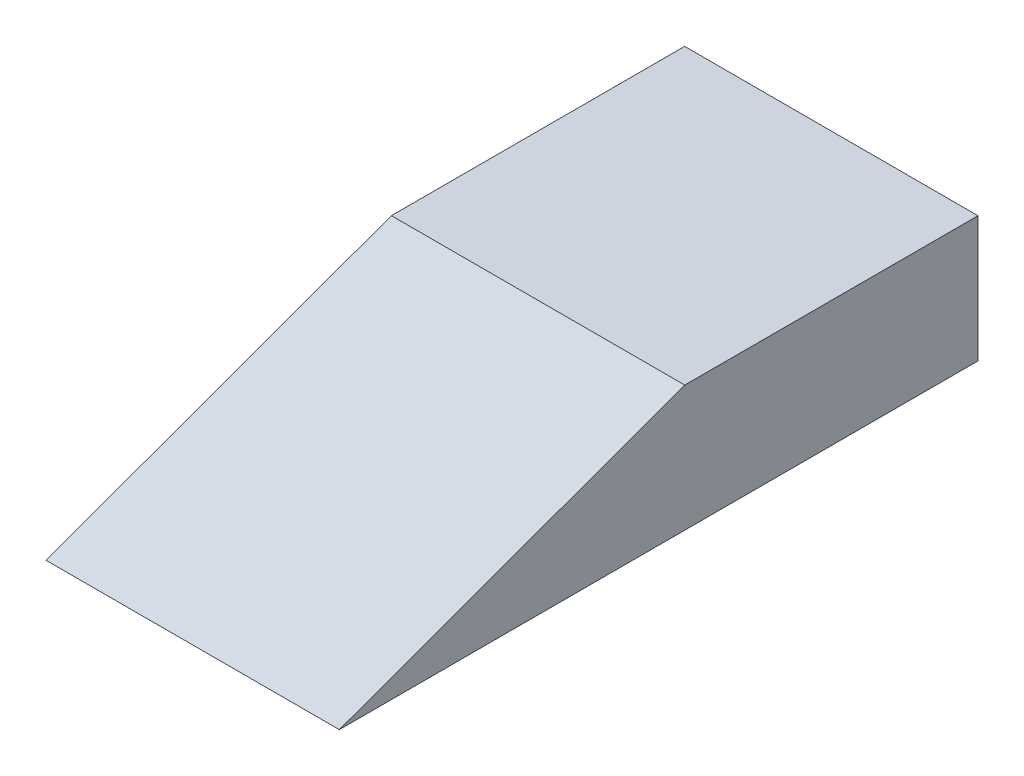
ISO-10303-21;
HEADER;
FILE_DESCRIPTION(('STEP AP214'),'2;1');
FILE_NAME('part.step','',(''),(''),'','','');
FILE_SCHEMA(('AUTOMOTIVE_DESIGN { 1 0 10303 214 1 1 1 1 }'));
ENDSEC;
DATA;
#1=APPLICATION_CONTEXT('core data for automotive mechanical design processes');
#2=APPLICATION_PROTOCOL_DEFINITION('international standard','automotive_design',2000,#1);
#3=PRODUCT_CONTEXT('',#1,'mechanical');
#4=PRODUCT('Part','Part','',(#3));
#5=PRODUCT_RELATED_PRODUCT_CATEGORY('part','',(#4));
#6=PRODUCT_DEFINITION_FORMATION('','',#4);
#7=PRODUCT_DEFINITION_CONTEXT('part definition',#1,'design');
#8=PRODUCT_DEFINITION('design','',#6,#7);
#9=PRODUCT_DEFINITION_SHAPE('','',#8);
#10=(LENGTH_UNIT() NAMED_UNIT(*) SI_UNIT(.MILLI.,.METRE.));
#11=(NAMED_UNIT(*) PLANE_ANGLE_UNIT() SI_UNIT($,.RADIAN.));
#12=(NAMED_UNIT(*) SI_UNIT($,.STERADIAN.) SOLID_ANGLE_UNIT());
#13=UNCERTAINTY_MEASURE_WITH_UNIT(LENGTH_MEASURE(1.E-05),#10,'distance_accuracy_value','');
#14=(GEOMETRIC_REPRESENTATION_CONTEXT(3) GLOBAL_UNCERTAINTY_ASSIGNED_CONTEXT((#13)) GLOBAL_UNIT_ASSIGNED_CONTEXT((#10,
#11,#12)) REPRESENTATION_CONTEXT('',''));
#15=CARTESIAN_POINT('',(0.,0.,0.));
#16=DIRECTION('',(0.,0.,1.));
#17=DIRECTION('',(1.,0.,0.));
#18=AXIS2_PLACEMENT_3D('',#15,#16,#17);
#19=CARTESIAN_POINT('',(350.,-88.0536277602524,0.));
#20=DIRECTION('',(0.,-1.,0.));
#21=DIRECTION('',(0.,0.,-1.));
#22=AXIS2_PLACEMENT_3D('',#19,#20,#21);
#23=PLANE('',#22);
#24=DIRECTION('',(0.,0.,1.));
#25=VECTOR('',#24,1.);
#26=CARTESIAN_POINT('',(0.,-88.0536277602524,0.));
#27=LINE('',#26,#25);
#28=CARTESIAN_POINT('',(0.,-88.0536277602523,-559.249211356467));
#29=VERTEX_POINT('',#28);
#30=CARTESIAN_POINT('',(0.,-88.0536277602524,202.750788643533));
#31=VERTEX_POINT('',#30);
#32=EDGE_CURVE('E99',#29,#31,#27,.T.);
#33=ORIENTED_EDGE('',*,*,#32,.F.);
#34=DIRECTION('',(-1.,0.,0.));
#35=VECTOR('',#34,1.);
#36=CARTESIAN_POINT('',(350.,-88.0536277602523,-559.249211356467));
#37=LINE('',#36,#35);
#38=CARTESIAN_POINT('',(350.,-88.0536277602523,-559.249211356467));
#39=VERTEX_POINT('',#38);
#40=EDGE_CURVE('E11',#39,#29,#37,.T.);
#41=ORIENTED_EDGE('',*,*,#40,.F.);
#42=DIRECTION('',(0.,0.,1.));
#43=VECTOR('',#42,1.);
#44=CARTESIAN_POINT('',(350.,-88.0536277602524,0.));
#45=LINE('',#44,#43);
#46=CARTESIAN_POINT('',(350.,-88.0536277602524,202.750788643533));
#47=VERTEX_POINT('',#46);
#48=EDGE_CURVE('E92',#39,#47,#45,.T.);
#49=ORIENTED_EDGE('',*,*,#48,.T.);
#50=DIRECTION('',(-1.,0.,0.));
#51=VECTOR('',#50,1.);
#52=CARTESIAN_POINT('',(350.,-88.0536277602524,202.750788643533));
#53=LINE('',#52,#51);
#54=EDGE_CURVE('E74',#47,#31,#53,.T.);
#55=ORIENTED_EDGE('',*,*,#54,.T.);
#56=EDGE_LOOP('',(#33,#41,#49,#55));
#57=FACE_BOUND('',#56,.T.);
#58=ADVANCED_FACE('F36',(#57),#23,.T.);
#59=CARTESIAN_POINT('',(350.,0.,-559.249211356467));
#60=DIRECTION('',(0.,0.,-1.));
#61=DIRECTION('',(-1.,0.,0.));
#62=AXIS2_PLACEMENT_3D('',#59,#60,#61);
#63=PLANE('',#62);
#64=DIRECTION('',(0.,-1.,0.));
#65=VECTOR('',#64,1.);
#66=CARTESIAN_POINT('',(0.,0.,-559.249211356467));
#67=LINE('',#66,#65);
#68=CARTESIAN_POINT('',(0.,61.9463722397476,-559.249211356467));
#69=VERTEX_POINT('',#68);
#70=EDGE_CURVE('E85',#69,#29,#67,.T.);
#71=ORIENTED_EDGE('',*,*,#70,.F.);
#72=DIRECTION('',(-1.,0.,0.));
#73=VECTOR('',#72,1.);
#74=CARTESIAN_POINT('',(350.,61.9463722397476,-559.249211356467));
#75=LINE('',#74,#73);
#76=CARTESIAN_POINT('',(350.,61.9463722397476,-559.249211356467));
#77=VERTEX_POINT('',#76);
#78=EDGE_CURVE('E44',#77,#69,#75,.T.);
#79=ORIENTED_EDGE('',*,*,#78,.F.);
#80=DIRECTION('',(0.,-1.,0.));
#81=VECTOR('',#80,1.);
#82=CARTESIAN_POINT('',(350.,0.,-559.249211356467));
#83=LINE('',#82,#81);
#84=EDGE_CURVE('E83',#77,#39,#83,.T.);
#85=ORIENTED_EDGE('',*,*,#84,.T.);
#86=ORIENTED_EDGE('',*,*,#40,.T.);
#87=EDGE_LOOP('',(#71,#79,#85,#86));
#88=FACE_BOUND('',#87,.T.);
#89=ADVANCED_FACE('F82',(#88),#63,.T.);
#90=CARTESIAN_POINT('',(350.,61.9463722397476,0.));
#91=DIRECTION('',(0.,1.,0.));
#92=DIRECTION('',(0.,0.,1.));
#93=AXIS2_PLACEMENT_3D('',#90,#91,#92);
#94=PLANE('',#93);
#95=DIRECTION('',(0.,0.,-1.));
#96=VECTOR('',#95,1.);
#97=CARTESIAN_POINT('',(0.,61.9463722397476,0.));
#98=LINE('',#97,#96);
#99=CARTESIAN_POINT('',(0.,61.9463722397476,-209.370824274668));
#100=VERTEX_POINT('',#99);
#101=EDGE_CURVE('E103',#100,#69,#98,.T.);
#102=ORIENTED_EDGE('',*,*,#101,.F.);
#103=DIRECTION('',(-1.,0.,0.));
#104=VECTOR('',#103,1.);
#105=CARTESIAN_POINT('',(350.,61.9463722397476,-209.370824274668));
#106=LINE('',#105,#104);
#107=CARTESIAN_POINT('',(350.,61.9463722397476,-209.370824274668));
#108=VERTEX_POINT('',#107);
#109=EDGE_CURVE('E67',#108,#100,#106,.T.);
#110=ORIENTED_EDGE('',*,*,#109,.F.);
#111=DIRECTION('',(0.,0.,-1.));
#112=VECTOR('',#111,1.);
#113=CARTESIAN_POINT('',(350.,61.9463722397476,0.));
#114=LINE('',#113,#112);
#115=EDGE_CURVE('E91',#108,#77,#114,.T.);
#116=ORIENTED_EDGE('',*,*,#115,.T.);
#117=ORIENTED_EDGE('',*,*,#78,.T.);
#118=EDGE_LOOP('',(#102,#110,#116,#117));
#119=FACE_BOUND('',#118,.T.);
#120=ADVANCED_FACE('F94',(#119),#94,.T.);
#121=CARTESIAN_POINT('',(350.,-12.5904626041129,-4.58255362353875));
#122=DIRECTION('',(0.,-0.93969262078591,-0.342020143325663));
#123=DIRECTION('',(0.,0.342020143325663,-0.939692620785911));
#124=AXIS2_PLACEMENT_3D('',#121,#122,#123);
#125=PLANE('',#124);
#126=DIRECTION('',(0.,-0.342020143325663,0.939692620785911));
#127=VECTOR('',#126,1.);
#128=CARTESIAN_POINT('',(0.,-12.5904626041129,-4.58255362353875));
#129=LINE('',#128,#127);
#130=EDGE_CURVE('E105',#100,#31,#129,.T.);
#131=ORIENTED_EDGE('',*,*,#130,.T.);
#132=ORIENTED_EDGE('',*,*,#54,.F.);
#133=DIRECTION('',(0.,-0.342020143325663,0.939692620785911));
#134=VECTOR('',#133,1.);
#135=CARTESIAN_POINT('',(350.,-12.5904626041129,-4.58255362353875));
#136=LINE('',#135,#134);
#137=EDGE_CURVE('E52',#108,#47,#136,.T.);
#138=ORIENTED_EDGE('',*,*,#137,.F.);
#139=ORIENTED_EDGE('',*,*,#109,.T.);
#140=EDGE_LOOP('',(#131,#132,#138,#139));
#141=FACE_BOUND('',#140,.T.);
#142=ADVANCED_FACE('F115',(#141),#125,.F.);
#143=CARTESIAN_POINT('',(350.,0.,0.));
#144=DIRECTION('',(1.,0.,0.));
#145=DIRECTION('',(0.,0.,-1.));
#146=AXIS2_PLACEMENT_3D('',#143,#144,#145);
#147=PLANE('',#146);
#148=ORIENTED_EDGE('',*,*,#48,.F.);
#149=ORIENTED_EDGE('',*,*,#84,.F.);
#150=ORIENTED_EDGE('',*,*,#115,.F.);
#151=ORIENTED_EDGE('',*,*,#137,.T.);
#152=EDGE_LOOP('',(#148,#149,#150,#151));
#153=FACE_BOUND('',#152,.T.);
#154=ADVANCED_FACE('F90',(#153),#147,.T.);
#155=CARTESIAN_POINT('',(0.,0.,0.));
#156=DIRECTION('',(1.,0.,0.));
#157=DIRECTION('',(0.,0.,-1.));
#158=AXIS2_PLACEMENT_3D('',#155,#156,#157);
#159=PLANE('',#158);
#160=ORIENTED_EDGE('',*,*,#32,.T.);
#161=ORIENTED_EDGE('',*,*,#130,.F.);
#162=ORIENTED_EDGE('',*,*,#101,.T.);
#163=ORIENTED_EDGE('',*,*,#70,.T.);
#164=EDGE_LOOP('',(#160,#161,#162,#163));
#165=FACE_BOUND('',#164,.T.);
#166=ADVANCED_FACE('F120',(#165),#159,.F.);
#167=CLOSED_SHELL('',(#58,#89,#120,#142,#154,#166));
#168=MANIFOLD_SOLID_BREP('B2',#167);
#169=ADVANCED_BREP_SHAPE_REPRESENTATION('',(#18,#168),#14);
#170=SHAPE_DEFINITION_REPRESENTATION(#9,#169);
ENDSEC;
END-ISO-10303-21;
